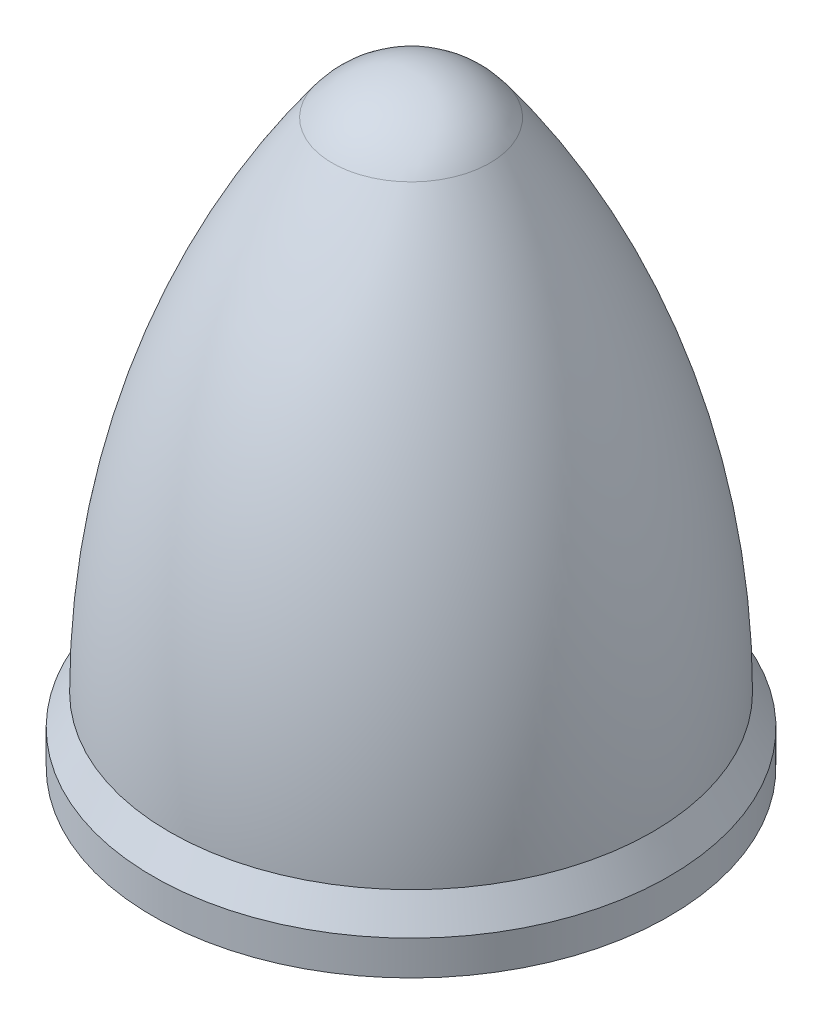
ISO-10303-21;
HEADER;
FILE_DESCRIPTION(('STEP AP214'),'2;1');
FILE_NAME('part.step','',(''),(''),'','','');
FILE_SCHEMA(('AUTOMOTIVE_DESIGN { 1 0 10303 214 1 1 1 1 }'));
ENDSEC;
DATA;
#1=APPLICATION_CONTEXT('core data for automotive mechanical design processes');
#2=APPLICATION_PROTOCOL_DEFINITION('international standard','automotive_design',2000,#1);
#3=PRODUCT_CONTEXT('',#1,'mechanical');
#4=PRODUCT('Part','Part','',(#3));
#5=PRODUCT_RELATED_PRODUCT_CATEGORY('part','',(#4));
#6=PRODUCT_DEFINITION_FORMATION('','',#4);
#7=PRODUCT_DEFINITION_CONTEXT('part definition',#1,'design');
#8=PRODUCT_DEFINITION('design','',#6,#7);
#9=PRODUCT_DEFINITION_SHAPE('','',#8);
#10=(LENGTH_UNIT() NAMED_UNIT(*) SI_UNIT(.MILLI.,.METRE.));
#11=(NAMED_UNIT(*) PLANE_ANGLE_UNIT() SI_UNIT($,.RADIAN.));
#12=(NAMED_UNIT(*) SI_UNIT($,.STERADIAN.) SOLID_ANGLE_UNIT());
#13=UNCERTAINTY_MEASURE_WITH_UNIT(LENGTH_MEASURE(1.E-05),#10,'distance_accuracy_value','');
#14=(GEOMETRIC_REPRESENTATION_CONTEXT(3) GLOBAL_UNCERTAINTY_ASSIGNED_CONTEXT((#13)) GLOBAL_UNIT_ASSIGNED_CONTEXT((#10,
#11,#12)) REPRESENTATION_CONTEXT('',''));
#15=CARTESIAN_POINT('',(0.,0.,0.));
#16=DIRECTION('',(0.,0.,1.));
#17=DIRECTION('',(1.,0.,0.));
#18=AXIS2_PLACEMENT_3D('',#15,#16,#17);
#19=CARTESIAN_POINT('',(0.,5.5,0.));
#20=DIRECTION('',(0.,-1.,0.));
#21=DIRECTION('',(0.,0.,-1.));
#22=AXIS2_PLACEMENT_3D('',#19,#20,#21);
#23=CYLINDRICAL_SURFACE('',#22,2.8);
#24=CARTESIAN_POINT('',(0.,-1.87686769209238,0.));
#25=DIRECTION('',(0.,-1.,0.));
#26=DIRECTION('',(0.,0.,-1.));
#27=AXIS2_PLACEMENT_3D('',#24,#25,#26);
#28=CIRCLE('',#27,2.8);
#29=CARTESIAN_POINT('',(0.,-1.87686769209238,-2.8));
#30=VERTEX_POINT('',#29);
#31=EDGE_CURVE('E60',#30,#30,#28,.T.);
#32=ORIENTED_EDGE('',*,*,#31,.T.);
#33=EDGE_LOOP('',(#32));
#34=FACE_BOUND('',#33,.T.);
#35=CARTESIAN_POINT('',(0.,5.5,0.));
#36=DIRECTION('',(0.,-1.,0.));
#37=DIRECTION('',(0.,0.,-1.));
#38=AXIS2_PLACEMENT_3D('',#35,#36,#37);
#39=CIRCLE('',#38,2.8);
#40=CARTESIAN_POINT('',(0.,5.5,-2.8));
#41=VERTEX_POINT('',#40);
#42=EDGE_CURVE('E10',#41,#41,#39,.T.);
#43=ORIENTED_EDGE('',*,*,#42,.F.);
#44=EDGE_LOOP('',(#43));
#45=FACE_BOUND('',#44,.T.);
#46=ADVANCED_FACE('F38',(#34,#45),#23,.F.);
#47=CARTESIAN_POINT('',(0.,5.5,-2.8));
#48=DIRECTION('',(0.,-1.,0.));
#49=DIRECTION('',(0.,0.,-1.));
#50=AXIS2_PLACEMENT_3D('',#47,#48,#49);
#51=PLANE('',#50);
#52=ORIENTED_EDGE('',*,*,#42,.T.);
#53=EDGE_LOOP('',(#52));
#54=FACE_BOUND('',#53,.T.);
#55=ADVANCED_FACE('F78',(#54),#51,.T.);
#56=CARTESIAN_POINT('',(0.,12.7681880350816,0.));
#57=DIRECTION('',(0.,-1.,0.));
#58=DIRECTION('',(0.,0.,-1.));
#59=AXIS2_PLACEMENT_3D('',#56,#57,#58);
#60=SPHERICAL_SURFACE('',#59,2.83181196491836);
#61=CARTESIAN_POINT('',(0.,14.4390225688948,0.));
#62=DIRECTION('',(0.,-1.,0.));
#63=DIRECTION('',(0.,0.,-1.));
#64=AXIS2_PLACEMENT_3D('',#61,#62,#63);
#65=CIRCLE('',#64,2.28636632350816);
#66=CARTESIAN_POINT('',(0.,14.4390225688948,-2.28636632350816));
#67=VERTEX_POINT('',#66);
#68=EDGE_CURVE('E44',#67,#67,#65,.T.);
#69=ORIENTED_EDGE('',*,*,#68,.F.);
#70=EDGE_LOOP('',(#69));
#71=FACE_BOUND('',#70,.T.);
#72=ADVANCED_FACE('F82',(#71),#60,.T.);
#73=CARTESIAN_POINT('',(0.,0.,0.));
#74=DIRECTION('',(0.,-1.,0.));
#75=DIRECTION('',(0.,0.,-1.));
#76=AXIS2_PLACEMENT_3D('',#73,#74,#75);
#77=DEGENERATE_TOROIDAL_SURFACE('',#76,17.4719605950492,24.4719605950492,.F.);
#78=ORIENTED_EDGE('',*,*,#68,.T.);
#79=EDGE_LOOP('',(#78));
#80=FACE_BOUND('',#79,.T.);
#81=CARTESIAN_POINT('',(0.,0.,0.));
#82=DIRECTION('',(0.,-1.,0.));
#83=DIRECTION('',(0.,0.,-1.));
#84=AXIS2_PLACEMENT_3D('',#81,#82,#83);
#85=CIRCLE('',#84,7.);
#86=CARTESIAN_POINT('',(0.,0.,-7.));
#87=VERTEX_POINT('',#86);
#88=EDGE_CURVE('E48',#87,#87,#85,.T.);
#89=ORIENTED_EDGE('',*,*,#88,.F.);
#90=EDGE_LOOP('',(#89));
#91=FACE_BOUND('',#90,.T.);
#92=ADVANCED_FACE('F86',(#80,#91),#77,.F.);
#93=CARTESIAN_POINT('',(0.,-0.876867692092382,0.));
#94=DIRECTION('',(0.,-1.,0.));
#95=DIRECTION('',(0.,0.,-1.));
#96=AXIS2_PLACEMENT_3D('',#93,#94,#95);
#97=CONICAL_SURFACE('',#96,7.48073178651362,0.501489067775038);
#98=ORIENTED_EDGE('',*,*,#88,.T.);
#99=EDGE_LOOP('',(#98));
#100=FACE_BOUND('',#99,.T.);
#101=CARTESIAN_POINT('',(0.,-0.876867692092382,0.));
#102=DIRECTION('',(0.,-1.,0.));
#103=DIRECTION('',(0.,0.,-1.));
#104=AXIS2_PLACEMENT_3D('',#101,#102,#103);
#105=CIRCLE('',#104,7.48073178651362);
#106=CARTESIAN_POINT('',(0.,-0.876867692092382,-7.48073178651362));
#107=VERTEX_POINT('',#106);
#108=EDGE_CURVE('E52',#107,#107,#105,.T.);
#109=ORIENTED_EDGE('',*,*,#108,.F.);
#110=EDGE_LOOP('',(#109));
#111=FACE_BOUND('',#110,.T.);
#112=ADVANCED_FACE('F74',(#100,#111),#97,.T.);
#113=CARTESIAN_POINT('',(0.,5.5,0.));
#114=DIRECTION('',(0.,-1.,0.));
#115=DIRECTION('',(0.,0.,-1.));
#116=AXIS2_PLACEMENT_3D('',#113,#114,#115);
#117=CYLINDRICAL_SURFACE('',#116,7.48073178651362);
#118=ORIENTED_EDGE('',*,*,#108,.T.);
#119=EDGE_LOOP('',(#118));
#120=FACE_BOUND('',#119,.T.);
#121=CARTESIAN_POINT('',(0.,-1.87686769209238,0.));
#122=DIRECTION('',(0.,-1.,0.));
#123=DIRECTION('',(0.,0.,-1.));
#124=AXIS2_PLACEMENT_3D('',#121,#122,#123);
#125=CIRCLE('',#124,7.48073178651362);
#126=CARTESIAN_POINT('',(0.,-1.87686769209238,-7.48073178651362));
#127=VERTEX_POINT('',#126);
#128=EDGE_CURVE('E57',#127,#127,#125,.T.);
#129=ORIENTED_EDGE('',*,*,#128,.F.);
#130=EDGE_LOOP('',(#129));
#131=FACE_BOUND('',#130,.T.);
#132=ADVANCED_FACE('F68',(#120,#131),#117,.T.);
#133=CARTESIAN_POINT('',(0.,-1.87686769209238,-7.48073178651362));
#134=DIRECTION('',(0.,-1.,0.));
#135=DIRECTION('',(0.,0.,-1.));
#136=AXIS2_PLACEMENT_3D('',#133,#134,#135);
#137=PLANE('',#136);
#138=ORIENTED_EDGE('',*,*,#128,.T.);
#139=EDGE_LOOP('',(#138));
#140=FACE_BOUND('',#139,.T.);
#141=ORIENTED_EDGE('',*,*,#31,.F.);
#142=EDGE_LOOP('',(#141));
#143=FACE_BOUND('',#142,.T.);
#144=ADVANCED_FACE('F66',(#140,#143),#137,.T.);
#145=CLOSED_SHELL('',(#46,#55,#72,#92,#112,#132,#144));
#146=MANIFOLD_SOLID_BREP('B2',#145);
#147=ADVANCED_BREP_SHAPE_REPRESENTATION('',(#18,#146),#14);
#148=SHAPE_DEFINITION_REPRESENTATION(#9,#147);
ENDSEC;
END-ISO-10303-21;
